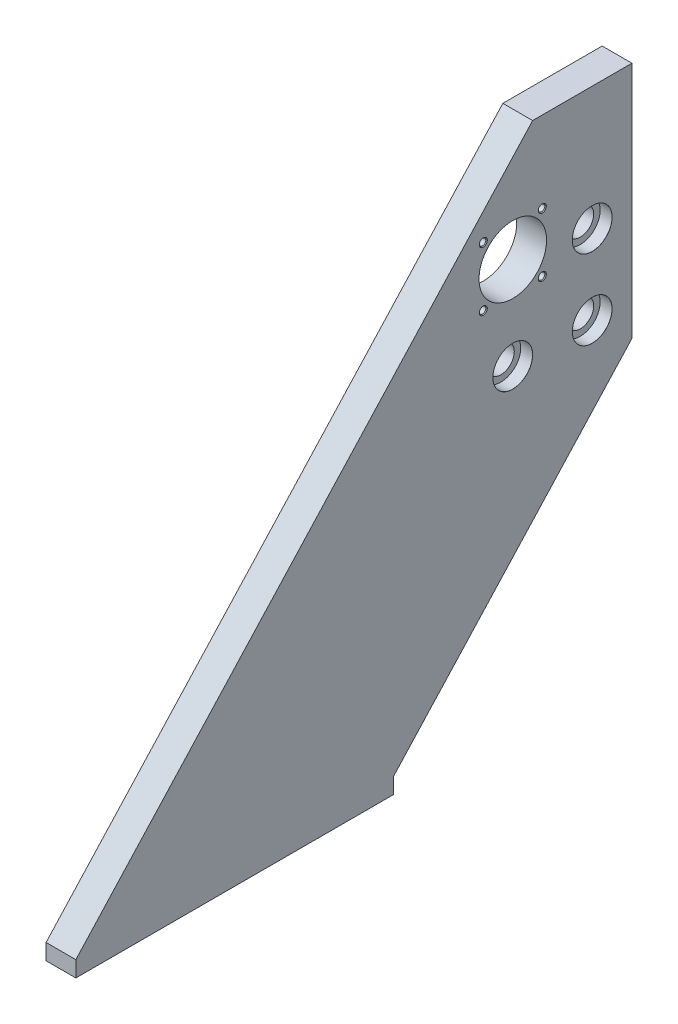
ISO-10303-21;
HEADER;
FILE_DESCRIPTION(('STEP AP214'),'2;1');
FILE_NAME('part.step','',(''),(''),'','','');
FILE_SCHEMA(('AUTOMOTIVE_DESIGN { 1 0 10303 214 1 1 1 1 }'));
ENDSEC;
DATA;
#1=APPLICATION_CONTEXT('core data for automotive mechanical design processes');
#2=APPLICATION_PROTOCOL_DEFINITION('international standard','automotive_design',2000,#1);
#3=PRODUCT_CONTEXT('',#1,'mechanical');
#4=PRODUCT('Part','Part','',(#3));
#5=PRODUCT_RELATED_PRODUCT_CATEGORY('part','',(#4));
#6=PRODUCT_DEFINITION_FORMATION('','',#4);
#7=PRODUCT_DEFINITION_CONTEXT('part definition',#1,'design');
#8=PRODUCT_DEFINITION('design','',#6,#7);
#9=PRODUCT_DEFINITION_SHAPE('','',#8);
#10=(LENGTH_UNIT() NAMED_UNIT(*) SI_UNIT(.MILLI.,.METRE.));
#11=(NAMED_UNIT(*) PLANE_ANGLE_UNIT() SI_UNIT($,.RADIAN.));
#12=(NAMED_UNIT(*) SI_UNIT($,.STERADIAN.) SOLID_ANGLE_UNIT());
#13=UNCERTAINTY_MEASURE_WITH_UNIT(LENGTH_MEASURE(1.E-05),#10,'distance_accuracy_value','');
#14=(GEOMETRIC_REPRESENTATION_CONTEXT(3) GLOBAL_UNCERTAINTY_ASSIGNED_CONTEXT((#13)) GLOBAL_UNIT_ASSIGNED_CONTEXT((#10,
#11,#12)) REPRESENTATION_CONTEXT('',''));
#15=CARTESIAN_POINT('',(0.,0.,0.));
#16=DIRECTION('',(0.,0.,1.));
#17=DIRECTION('',(1.,0.,0.));
#18=AXIS2_PLACEMENT_3D('',#15,#16,#17);
#19=CARTESIAN_POINT('',(7.5,8.,80.));
#20=DIRECTION('',(0.,0.,-1.));
#21=DIRECTION('',(0.,1.,0.));
#22=AXIS2_PLACEMENT_3D('',#19,#20,#21);
#23=PLANE('',#22);
#24=DIRECTION('',(0.,-1.,0.));
#25=VECTOR('',#24,1.);
#26=CARTESIAN_POINT('',(-7.5,8.,80.));
#27=LINE('',#26,#25);
#28=CARTESIAN_POINT('',(-7.5,8.,80.));
#29=VERTEX_POINT('',#28);
#30=CARTESIAN_POINT('',(-7.5,0.,80.));
#31=VERTEX_POINT('',#30);
#32=EDGE_CURVE('E132',#29,#31,#27,.T.);
#33=ORIENTED_EDGE('',*,*,#32,.T.);
#34=DIRECTION('',(-1.,0.,0.));
#35=VECTOR('',#34,1.);
#36=CARTESIAN_POINT('',(7.5,0.,80.));
#37=LINE('',#36,#35);
#38=CARTESIAN_POINT('',(7.5,0.,80.));
#39=VERTEX_POINT('',#38);
#40=EDGE_CURVE('E11',#39,#31,#37,.T.);
#41=ORIENTED_EDGE('',*,*,#40,.F.);
#42=DIRECTION('',(0.,-1.,0.));
#43=VECTOR('',#42,1.);
#44=CARTESIAN_POINT('',(7.5,8.,80.));
#45=LINE('',#44,#43);
#46=CARTESIAN_POINT('',(7.5,8.,80.));
#47=VERTEX_POINT('',#46);
#48=EDGE_CURVE('E145',#47,#39,#45,.T.);
#49=ORIENTED_EDGE('',*,*,#48,.F.);
#50=DIRECTION('',(-1.,0.,0.));
#51=VECTOR('',#50,1.);
#52=CARTESIAN_POINT('',(7.5,8.,80.));
#53=LINE('',#52,#51);
#54=EDGE_CURVE('E128',#47,#29,#53,.T.);
#55=ORIENTED_EDGE('',*,*,#54,.T.);
#56=EDGE_LOOP('',(#33,#41,#49,#55));
#57=FACE_BOUND('',#56,.T.);
#58=ADVANCED_FACE('F39',(#57),#23,.F.);
#59=CARTESIAN_POINT('',(7.5,0.,0.));
#60=DIRECTION('',(0.,1.,0.));
#61=DIRECTION('',(0.,0.,1.));
#62=AXIS2_PLACEMENT_3D('',#59,#60,#61);
#63=PLANE('',#62);
#64=CARTESIAN_POINT('',(0.,0.,50.));
#65=DIRECTION('',(0.,-1.,0.));
#66=DIRECTION('',(0.,0.,-1.));
#67=AXIS2_PLACEMENT_3D('',#64,#65,#66);
#68=CIRCLE('',#67,3.4);
#69=CARTESIAN_POINT('',(0.,0.,46.6));
#70=VERTEX_POINT('',#69);
#71=EDGE_CURVE('E176',#70,#70,#68,.T.);
#72=ORIENTED_EDGE('',*,*,#71,.F.);
#73=EDGE_LOOP('',(#72));
#74=FACE_BOUND('',#73,.T.);
#75=CARTESIAN_POINT('',(0.,0.,-50.));
#76=DIRECTION('',(0.,-1.,0.));
#77=DIRECTION('',(0.,0.,-1.));
#78=AXIS2_PLACEMENT_3D('',#75,#76,#77);
#79=CIRCLE('',#78,3.4);
#80=CARTESIAN_POINT('',(0.,0.,-53.4));
#81=VERTEX_POINT('',#80);
#82=EDGE_CURVE('E170',#81,#81,#79,.T.);
#83=ORIENTED_EDGE('',*,*,#82,.F.);
#84=EDGE_LOOP('',(#83));
#85=FACE_BOUND('',#84,.T.);
#86=DIRECTION('',(0.,0.,-1.));
#87=VECTOR('',#86,1.);
#88=CARTESIAN_POINT('',(-7.5,0.,0.));
#89=LINE('',#88,#87);
#90=CARTESIAN_POINT('',(-7.5,0.,-80.));
#91=VERTEX_POINT('',#90);
#92=EDGE_CURVE('E135',#31,#91,#89,.T.);
#93=ORIENTED_EDGE('',*,*,#92,.T.);
#94=DIRECTION('',(-1.,0.,0.));
#95=VECTOR('',#94,1.);
#96=CARTESIAN_POINT('',(7.5,0.,-80.));
#97=LINE('',#96,#95);
#98=CARTESIAN_POINT('',(7.5,0.,-80.));
#99=VERTEX_POINT('',#98);
#100=EDGE_CURVE('E47',#99,#91,#97,.T.);
#101=ORIENTED_EDGE('',*,*,#100,.F.);
#102=DIRECTION('',(0.,0.,-1.));
#103=VECTOR('',#102,1.);
#104=CARTESIAN_POINT('',(7.5,0.,80.));
#105=LINE('',#104,#103);
#106=EDGE_CURVE('E96',#39,#99,#105,.T.);
#107=ORIENTED_EDGE('',*,*,#106,.F.);
#108=ORIENTED_EDGE('',*,*,#40,.T.);
#109=EDGE_LOOP('',(#93,#101,#107,#108));
#110=FACE_BOUND('',#109,.T.);
#111=ADVANCED_FACE('F305',(#74,#85,#110),#63,.F.);
#112=CARTESIAN_POINT('',(7.5,0.,-80.));
#113=DIRECTION('',(0.,0.,1.));
#114=DIRECTION('',(1.,0.,0.));
#115=AXIS2_PLACEMENT_3D('',#112,#113,#114);
#116=PLANE('',#115);
#117=DIRECTION('',(0.,1.,0.));
#118=VECTOR('',#117,1.);
#119=CARTESIAN_POINT('',(-7.5,0.,-80.));
#120=LINE('',#119,#118);
#121=CARTESIAN_POINT('',(-7.5,8.,-80.));
#122=VERTEX_POINT('',#121);
#123=EDGE_CURVE('E138',#91,#122,#120,.T.);
#124=ORIENTED_EDGE('',*,*,#123,.T.);
#125=DIRECTION('',(-1.,0.,0.));
#126=VECTOR('',#125,1.);
#127=CARTESIAN_POINT('',(7.5,8.,-80.));
#128=LINE('',#127,#126);
#129=CARTESIAN_POINT('',(7.5,8.,-80.));
#130=VERTEX_POINT('',#129);
#131=EDGE_CURVE('E149',#130,#122,#128,.T.);
#132=ORIENTED_EDGE('',*,*,#131,.F.);
#133=DIRECTION('',(0.,1.,0.));
#134=VECTOR('',#133,1.);
#135=CARTESIAN_POINT('',(7.5,0.,-80.));
#136=LINE('',#135,#134);
#137=EDGE_CURVE('E157',#99,#130,#136,.T.);
#138=ORIENTED_EDGE('',*,*,#137,.F.);
#139=ORIENTED_EDGE('',*,*,#100,.T.);
#140=EDGE_LOOP('',(#124,#132,#138,#139));
#141=FACE_BOUND('',#140,.T.);
#142=ADVANCED_FACE('F155',(#141),#116,.F.);
#143=CARTESIAN_POINT('',(7.5,8.,-80.));
#144=DIRECTION('',(0.,0.675724628517346,0.737154140200741));
#145=DIRECTION('',(0.,-0.737154140200741,0.675724628517346));
#146=AXIS2_PLACEMENT_3D('',#143,#144,#145);
#147=PLANE('',#146);
#148=DIRECTION('',(0.,0.737154140200741,-0.675724628517346));
#149=VECTOR('',#148,1.);
#150=CARTESIAN_POINT('',(-7.5,8.,-80.));
#151=LINE('',#150,#149);
#152=CARTESIAN_POINT('',(-7.5,138.909090909091,-200.));
#153=VERTEX_POINT('',#152);
#154=EDGE_CURVE('E140',#122,#153,#151,.T.);
#155=ORIENTED_EDGE('',*,*,#154,.T.);
#156=DIRECTION('',(-1.,0.,0.));
#157=VECTOR('',#156,1.);
#158=CARTESIAN_POINT('',(7.5,138.909090909091,-200.));
#159=LINE('',#158,#157);
#160=CARTESIAN_POINT('',(7.5,138.909090909091,-200.));
#161=VERTEX_POINT('',#160);
#162=EDGE_CURVE('E123',#161,#153,#159,.T.);
#163=ORIENTED_EDGE('',*,*,#162,.F.);
#164=DIRECTION('',(0.,0.737154140200741,-0.675724628517346));
#165=VECTOR('',#164,1.);
#166=CARTESIAN_POINT('',(7.5,8.,-80.));
#167=LINE('',#166,#165);
#168=EDGE_CURVE('E114',#130,#161,#167,.T.);
#169=ORIENTED_EDGE('',*,*,#168,.F.);
#170=ORIENTED_EDGE('',*,*,#131,.T.);
#171=EDGE_LOOP('',(#155,#163,#169,#170));
#172=FACE_BOUND('',#171,.T.);
#173=ADVANCED_FACE('F163',(#172),#147,.F.);
#174=CARTESIAN_POINT('',(7.5,138.909090909091,-200.));
#175=DIRECTION('',(0.,0.,1.));
#176=DIRECTION('',(1.,0.,0.));
#177=AXIS2_PLACEMENT_3D('',#174,#175,#176);
#178=PLANE('',#177);
#179=DIRECTION('',(0.,1.,0.));
#180=VECTOR('',#179,1.);
#181=CARTESIAN_POINT('',(-7.5,138.909090909091,-200.));
#182=LINE('',#181,#180);
#183=CARTESIAN_POINT('',(-7.5,258.909090909091,-200.));
#184=VERTEX_POINT('',#183);
#185=EDGE_CURVE('E122',#153,#184,#182,.T.);
#186=ORIENTED_EDGE('',*,*,#185,.T.);
#187=DIRECTION('',(-1.,0.,0.));
#188=VECTOR('',#187,1.);
#189=CARTESIAN_POINT('',(7.5,258.909090909091,-200.));
#190=LINE('',#189,#188);
#191=CARTESIAN_POINT('',(7.5,258.909090909091,-200.));
#192=VERTEX_POINT('',#191);
#193=EDGE_CURVE('E119',#192,#184,#190,.T.);
#194=ORIENTED_EDGE('',*,*,#193,.F.);
#195=DIRECTION('',(0.,1.,0.));
#196=VECTOR('',#195,1.);
#197=CARTESIAN_POINT('',(7.5,138.909090909091,-200.));
#198=LINE('',#197,#196);
#199=EDGE_CURVE('E108',#161,#192,#198,.T.);
#200=ORIENTED_EDGE('',*,*,#199,.F.);
#201=ORIENTED_EDGE('',*,*,#162,.T.);
#202=EDGE_LOOP('',(#186,#194,#200,#201));
#203=FACE_BOUND('',#202,.T.);
#204=ADVANCED_FACE('F120',(#203),#178,.F.);
#205=CARTESIAN_POINT('',(7.5,258.909090909091,-200.));
#206=DIRECTION('',(0.,-1.,0.));
#207=DIRECTION('',(0.,0.,-1.));
#208=AXIS2_PLACEMENT_3D('',#205,#206,#207);
#209=PLANE('',#208);
#210=DIRECTION('',(0.,0.,1.));
#211=VECTOR('',#210,1.);
#212=CARTESIAN_POINT('',(-7.5,258.909090909091,-200.));
#213=LINE('',#212,#211);
#214=CARTESIAN_POINT('',(-7.5,258.909090909091,-150.));
#215=VERTEX_POINT('',#214);
#216=EDGE_CURVE('E82',#184,#215,#213,.T.);
#217=ORIENTED_EDGE('',*,*,#216,.T.);
#218=DIRECTION('',(-1.,0.,0.));
#219=VECTOR('',#218,1.);
#220=CARTESIAN_POINT('',(7.5,258.909090909091,-150.));
#221=LINE('',#220,#219);
#222=CARTESIAN_POINT('',(7.5,258.909090909091,-150.));
#223=VERTEX_POINT('',#222);
#224=EDGE_CURVE('E124',#223,#215,#221,.T.);
#225=ORIENTED_EDGE('',*,*,#224,.F.);
#226=DIRECTION('',(0.,0.,1.));
#227=VECTOR('',#226,1.);
#228=CARTESIAN_POINT('',(7.5,258.909090909091,-200.));
#229=LINE('',#228,#227);
#230=EDGE_CURVE('E112',#192,#223,#229,.T.);
#231=ORIENTED_EDGE('',*,*,#230,.F.);
#232=ORIENTED_EDGE('',*,*,#193,.T.);
#233=EDGE_LOOP('',(#217,#225,#231,#232));
#234=FACE_BOUND('',#233,.T.);
#235=ADVANCED_FACE('F126',(#234),#209,.F.);
#236=CARTESIAN_POINT('',(7.5,258.909090909091,-150.));
#237=DIRECTION('',(0.,-0.675724628517346,-0.737154140200741));
#238=DIRECTION('',(0.,0.737154140200741,-0.675724628517346));
#239=AXIS2_PLACEMENT_3D('',#236,#237,#238);
#240=PLANE('',#239);
#241=DIRECTION('',(0.,-0.737154140200741,0.675724628517346));
#242=VECTOR('',#241,1.);
#243=CARTESIAN_POINT('',(-7.5,258.909090909091,-150.));
#244=LINE('',#243,#242);
#245=EDGE_CURVE('E88',#215,#29,#244,.T.);
#246=ORIENTED_EDGE('',*,*,#245,.T.);
#247=ORIENTED_EDGE('',*,*,#54,.F.);
#248=DIRECTION('',(0.,-0.737154140200741,0.675724628517346));
#249=VECTOR('',#248,1.);
#250=CARTESIAN_POINT('',(7.5,258.909090909091,-150.));
#251=LINE('',#250,#249);
#252=EDGE_CURVE('E55',#223,#47,#251,.T.);
#253=ORIENTED_EDGE('',*,*,#252,.F.);
#254=ORIENTED_EDGE('',*,*,#224,.T.);
#255=EDGE_LOOP('',(#246,#247,#253,#254));
#256=FACE_BOUND('',#255,.T.);
#257=ADVANCED_FACE('F271',(#256),#240,.F.);
#258=CARTESIAN_POINT('',(7.5,0.,0.));
#259=DIRECTION('',(1.,0.,0.));
#260=DIRECTION('',(0.,0.,-1.));
#261=AXIS2_PLACEMENT_3D('',#258,#259,#260);
#262=PLANE('',#261);
#263=CARTESIAN_POINT('',(7.5,218.149242404918,-154.849242404918));
#264=DIRECTION('',(1.,0.,0.));
#265=DIRECTION('',(0.,0.,-1.));
#266=AXIS2_PLACEMENT_3D('',#263,#264,#265);
#267=CIRCLE('',#266,2.025);
#268=CARTESIAN_POINT('',(7.5,218.149242404918,-156.874242404918));
#269=VERTEX_POINT('',#268);
#270=EDGE_CURVE('E263',#269,#269,#267,.T.);
#271=ORIENTED_EDGE('',*,*,#270,.F.);
#272=EDGE_LOOP('',(#271));
#273=FACE_BOUND('',#272,.T.);
#274=CARTESIAN_POINT('',(7.5,188.450757595082,-154.849242404918));
#275=DIRECTION('',(1.,0.,0.));
#276=DIRECTION('',(0.,0.,-1.));
#277=AXIS2_PLACEMENT_3D('',#274,#275,#276);
#278=CIRCLE('',#277,2.025);
#279=CARTESIAN_POINT('',(7.5,188.450757595082,-156.874242404918));
#280=VERTEX_POINT('',#279);
#281=EDGE_CURVE('E254',#280,#280,#278,.T.);
#282=ORIENTED_EDGE('',*,*,#281,.F.);
#283=EDGE_LOOP('',(#282));
#284=FACE_BOUND('',#283,.T.);
#285=CARTESIAN_POINT('',(7.5,188.450757595083,-125.150757595083));
#286=DIRECTION('',(1.,0.,0.));
#287=DIRECTION('',(0.,0.,-1.));
#288=AXIS2_PLACEMENT_3D('',#285,#286,#287);
#289=CIRCLE('',#288,2.025);
#290=CARTESIAN_POINT('',(7.5,188.450757595083,-127.175757595083));
#291=VERTEX_POINT('',#290);
#292=EDGE_CURVE('E245',#291,#291,#289,.T.);
#293=ORIENTED_EDGE('',*,*,#292,.F.);
#294=EDGE_LOOP('',(#293));
#295=FACE_BOUND('',#294,.T.);
#296=CARTESIAN_POINT('',(7.5,218.149242404917,-125.150757595082));
#297=DIRECTION('',(1.,0.,0.));
#298=DIRECTION('',(0.,0.,-1.));
#299=AXIS2_PLACEMENT_3D('',#296,#297,#298);
#300=CIRCLE('',#299,2.025);
#301=CARTESIAN_POINT('',(7.5,218.149242404917,-127.175757595082));
#302=VERTEX_POINT('',#301);
#303=EDGE_CURVE('E236',#302,#302,#300,.T.);
#304=ORIENTED_EDGE('',*,*,#303,.F.);
#305=EDGE_LOOP('',(#304));
#306=FACE_BOUND('',#305,.T.);
#307=CARTESIAN_POINT('',(7.5,203.3,-140.));
#308=DIRECTION('',(1.,0.,0.));
#309=DIRECTION('',(0.,0.,-1.));
#310=AXIS2_PLACEMENT_3D('',#307,#308,#309);
#311=CIRCLE('',#310,17.);
#312=CARTESIAN_POINT('',(7.5,203.3,-157.));
#313=VERTEX_POINT('',#312);
#314=EDGE_CURVE('E225',#313,#313,#311,.T.);
#315=ORIENTED_EDGE('',*,*,#314,.F.);
#316=EDGE_LOOP('',(#315));
#317=FACE_BOUND('',#316,.T.);
#318=CARTESIAN_POINT('',(7.5,196.809090909091,-180.));
#319=DIRECTION('',(1.,0.,0.));
#320=DIRECTION('',(0.,0.,-1.));
#321=AXIS2_PLACEMENT_3D('',#318,#319,#320);
#322=CIRCLE('',#321,10.025);
#323=CARTESIAN_POINT('',(7.5,196.809090909091,-190.025));
#324=VERTEX_POINT('',#323);
#325=EDGE_CURVE('E221',#324,#324,#322,.T.);
#326=ORIENTED_EDGE('',*,*,#325,.F.);
#327=EDGE_LOOP('',(#326));
#328=FACE_BOUND('',#327,.T.);
#329=CARTESIAN_POINT('',(7.5,156.809090909091,-180.));
#330=DIRECTION('',(1.,0.,0.));
#331=DIRECTION('',(0.,0.,-1.));
#332=AXIS2_PLACEMENT_3D('',#329,#330,#331);
#333=CIRCLE('',#332,10.025);
#334=CARTESIAN_POINT('',(7.5,156.809090909091,-190.025));
#335=VERTEX_POINT('',#334);
#336=EDGE_CURVE('E206',#335,#335,#333,.T.);
#337=ORIENTED_EDGE('',*,*,#336,.F.);
#338=EDGE_LOOP('',(#337));
#339=FACE_BOUND('',#338,.T.);
#340=CARTESIAN_POINT('',(7.5,156.809090909091,-140.));
#341=DIRECTION('',(1.,0.,0.));
#342=DIRECTION('',(0.,0.,-1.));
#343=AXIS2_PLACEMENT_3D('',#340,#341,#342);
#344=CIRCLE('',#343,10.025);
#345=CARTESIAN_POINT('',(7.5,156.809090909091,-150.025));
#346=VERTEX_POINT('',#345);
#347=EDGE_CURVE('E191',#346,#346,#344,.T.);
#348=ORIENTED_EDGE('',*,*,#347,.F.);
#349=EDGE_LOOP('',(#348));
#350=FACE_BOUND('',#349,.T.);
#351=ORIENTED_EDGE('',*,*,#48,.T.);
#352=ORIENTED_EDGE('',*,*,#106,.T.);
#353=ORIENTED_EDGE('',*,*,#137,.T.);
#354=ORIENTED_EDGE('',*,*,#168,.T.);
#355=ORIENTED_EDGE('',*,*,#199,.T.);
#356=ORIENTED_EDGE('',*,*,#230,.T.);
#357=ORIENTED_EDGE('',*,*,#252,.T.);
#358=EDGE_LOOP('',(#351,#352,#353,#354,#355,#356,#357));
#359=FACE_BOUND('',#358,.T.);
#360=ADVANCED_FACE('F110',(#273,#284,#295,#306,#317,#328,#339,#350,#359),#262,.T.);
#361=CARTESIAN_POINT('',(-7.5,0.,0.));
#362=DIRECTION('',(1.,0.,0.));
#363=DIRECTION('',(0.,0.,-1.));
#364=AXIS2_PLACEMENT_3D('',#361,#362,#363);
#365=PLANE('',#364);
#366=CARTESIAN_POINT('',(-7.5,218.149242404918,-154.849242404918));
#367=DIRECTION('',(1.,0.,0.));
#368=DIRECTION('',(0.,0.,-1.));
#369=AXIS2_PLACEMENT_3D('',#366,#367,#368);
#370=CIRCLE('',#369,1.64999999999998);
#371=CARTESIAN_POINT('',(-7.5,218.149242404918,-156.499242404918));
#372=VERTEX_POINT('',#371);
#373=EDGE_CURVE('E257',#372,#372,#370,.T.);
#374=ORIENTED_EDGE('',*,*,#373,.T.);
#375=EDGE_LOOP('',(#374));
#376=FACE_BOUND('',#375,.T.);
#377=CARTESIAN_POINT('',(-7.5,188.450757595082,-154.849242404918));
#378=DIRECTION('',(1.,0.,0.));
#379=DIRECTION('',(0.,0.,-1.));
#380=AXIS2_PLACEMENT_3D('',#377,#378,#379);
#381=CIRCLE('',#380,1.64999999999998);
#382=CARTESIAN_POINT('',(-7.5,188.450757595082,-156.499242404918));
#383=VERTEX_POINT('',#382);
#384=EDGE_CURVE('E248',#383,#383,#381,.T.);
#385=ORIENTED_EDGE('',*,*,#384,.T.);
#386=EDGE_LOOP('',(#385));
#387=FACE_BOUND('',#386,.T.);
#388=CARTESIAN_POINT('',(-7.5,188.450757595083,-125.150757595083));
#389=DIRECTION('',(1.,0.,0.));
#390=DIRECTION('',(0.,0.,-1.));
#391=AXIS2_PLACEMENT_3D('',#388,#389,#390);
#392=CIRCLE('',#391,1.64999999999998);
#393=CARTESIAN_POINT('',(-7.5,188.450757595083,-126.800757595083));
#394=VERTEX_POINT('',#393);
#395=EDGE_CURVE('E239',#394,#394,#392,.T.);
#396=ORIENTED_EDGE('',*,*,#395,.T.);
#397=EDGE_LOOP('',(#396));
#398=FACE_BOUND('',#397,.T.);
#399=CARTESIAN_POINT('',(-7.5,218.149242404917,-125.150757595082));
#400=DIRECTION('',(1.,0.,0.));
#401=DIRECTION('',(0.,0.,-1.));
#402=AXIS2_PLACEMENT_3D('',#399,#400,#401);
#403=CIRCLE('',#402,1.64999999999998);
#404=CARTESIAN_POINT('',(-7.5,218.149242404917,-126.800757595082));
#405=VERTEX_POINT('',#404);
#406=EDGE_CURVE('E228',#405,#405,#403,.T.);
#407=ORIENTED_EDGE('',*,*,#406,.T.);
#408=EDGE_LOOP('',(#407));
#409=FACE_BOUND('',#408,.T.);
#410=CARTESIAN_POINT('',(-7.5,203.3,-140.));
#411=DIRECTION('',(1.,0.,0.));
#412=DIRECTION('',(0.,0.,-1.));
#413=AXIS2_PLACEMENT_3D('',#410,#411,#412);
#414=CIRCLE('',#413,17.);
#415=CARTESIAN_POINT('',(-7.5,203.3,-157.));
#416=VERTEX_POINT('',#415);
#417=EDGE_CURVE('E224',#416,#416,#414,.T.);
#418=ORIENTED_EDGE('',*,*,#417,.T.);
#419=EDGE_LOOP('',(#418));
#420=FACE_BOUND('',#419,.T.);
#421=CARTESIAN_POINT('',(-7.5,196.809090909091,-180.));
#422=DIRECTION('',(1.,0.,0.));
#423=DIRECTION('',(0.,0.,-1.));
#424=AXIS2_PLACEMENT_3D('',#421,#422,#423);
#425=CIRCLE('',#424,6.75000000000001);
#426=CARTESIAN_POINT('',(-7.5,196.809090909091,-186.75));
#427=VERTEX_POINT('',#426);
#428=EDGE_CURVE('E209',#427,#427,#425,.T.);
#429=ORIENTED_EDGE('',*,*,#428,.T.);
#430=EDGE_LOOP('',(#429));
#431=FACE_BOUND('',#430,.T.);
#432=CARTESIAN_POINT('',(-7.5,156.809090909091,-180.));
#433=DIRECTION('',(1.,0.,0.));
#434=DIRECTION('',(0.,0.,-1.));
#435=AXIS2_PLACEMENT_3D('',#432,#433,#434);
#436=CIRCLE('',#435,6.75000000000001);
#437=CARTESIAN_POINT('',(-7.5,156.809090909091,-186.75));
#438=VERTEX_POINT('',#437);
#439=EDGE_CURVE('E194',#438,#438,#436,.T.);
#440=ORIENTED_EDGE('',*,*,#439,.T.);
#441=EDGE_LOOP('',(#440));
#442=FACE_BOUND('',#441,.T.);
#443=CARTESIAN_POINT('',(-7.5,156.809090909091,-140.));
#444=DIRECTION('',(1.,0.,0.));
#445=DIRECTION('',(0.,0.,-1.));
#446=AXIS2_PLACEMENT_3D('',#443,#444,#445);
#447=CIRCLE('',#446,6.75000000000001);
#448=CARTESIAN_POINT('',(-7.5,156.809090909091,-146.75));
#449=VERTEX_POINT('',#448);
#450=EDGE_CURVE('E179',#449,#449,#447,.T.);
#451=ORIENTED_EDGE('',*,*,#450,.T.);
#452=EDGE_LOOP('',(#451));
#453=FACE_BOUND('',#452,.T.);
#454=ORIENTED_EDGE('',*,*,#32,.F.);
#455=ORIENTED_EDGE('',*,*,#245,.F.);
#456=ORIENTED_EDGE('',*,*,#216,.F.);
#457=ORIENTED_EDGE('',*,*,#185,.F.);
#458=ORIENTED_EDGE('',*,*,#154,.F.);
#459=ORIENTED_EDGE('',*,*,#123,.F.);
#460=ORIENTED_EDGE('',*,*,#92,.F.);
#461=EDGE_LOOP('',(#454,#455,#456,#457,#458,#459,#460));
#462=FACE_BOUND('',#461,.T.);
#463=ADVANCED_FACE('F161',(#376,#387,#398,#409,#420,#431,#442,#453,#462),#365,.F.);
#464=CARTESIAN_POINT('',(0.,30.,-50.));
#465=DIRECTION('',(0.,-1.,0.));
#466=DIRECTION('',(0.,0.,-1.));
#467=AXIS2_PLACEMENT_3D('',#464,#465,#466);
#468=CONICAL_SURFACE('',#467,3.39999999999999,1.02974425867665);
#469=CARTESIAN_POINT('',(0.,32.0429261046937,-50.));
#470=VERTEX_POINT('',#469);
#471=VERTEX_LOOP('',#470);
#472=FACE_BOUND('',#471,.T.);
#473=CARTESIAN_POINT('',(0.,30.,-50.));
#474=DIRECTION('',(0.,-1.,0.));
#475=DIRECTION('',(0.,0.,-1.));
#476=AXIS2_PLACEMENT_3D('',#473,#474,#475);
#477=CIRCLE('',#476,3.39999999999999);
#478=CARTESIAN_POINT('',(0.,30.,-53.4));
#479=VERTEX_POINT('',#478);
#480=EDGE_CURVE('E136',#479,#479,#477,.T.);
#481=ORIENTED_EDGE('',*,*,#480,.T.);
#482=EDGE_LOOP('',(#481));
#483=FACE_BOUND('',#482,.T.);
#484=ADVANCED_FACE('F357',(#472,#483),#468,.F.);
#485=CARTESIAN_POINT('',(0.,0.,-50.));
#486=DIRECTION('',(0.,-1.,0.));
#487=DIRECTION('',(0.,0.,-1.));
#488=AXIS2_PLACEMENT_3D('',#485,#486,#487);
#489=CYLINDRICAL_SURFACE('',#488,3.4);
#490=ORIENTED_EDGE('',*,*,#480,.F.);
#491=EDGE_LOOP('',(#490));
#492=FACE_BOUND('',#491,.T.);
#493=ORIENTED_EDGE('',*,*,#82,.T.);
#494=EDGE_LOOP('',(#493));
#495=FACE_BOUND('',#494,.T.);
#496=ADVANCED_FACE('F362',(#492,#495),#489,.F.);
#497=CARTESIAN_POINT('',(0.,30.,50.));
#498=DIRECTION('',(0.,-1.,0.));
#499=DIRECTION('',(0.,0.,-1.));
#500=AXIS2_PLACEMENT_3D('',#497,#498,#499);
#501=CONICAL_SURFACE('',#500,3.39999999999999,1.02974425867665);
#502=CARTESIAN_POINT('',(0.,32.0429261046937,50.));
#503=VERTEX_POINT('',#502);
#504=VERTEX_LOOP('',#503);
#505=FACE_BOUND('',#504,.T.);
#506=CARTESIAN_POINT('',(0.,30.,50.));
#507=DIRECTION('',(0.,-1.,0.));
#508=DIRECTION('',(0.,0.,-1.));
#509=AXIS2_PLACEMENT_3D('',#506,#507,#508);
#510=CIRCLE('',#509,3.39999999999999);
#511=CARTESIAN_POINT('',(0.,30.,46.6));
#512=VERTEX_POINT('',#511);
#513=EDGE_CURVE('E173',#512,#512,#510,.T.);
#514=ORIENTED_EDGE('',*,*,#513,.T.);
#515=EDGE_LOOP('',(#514));
#516=FACE_BOUND('',#515,.T.);
#517=ADVANCED_FACE('F375',(#505,#516),#501,.F.);
#518=CARTESIAN_POINT('',(0.,0.,50.));
#519=DIRECTION('',(0.,-1.,0.));
#520=DIRECTION('',(0.,0.,-1.));
#521=AXIS2_PLACEMENT_3D('',#518,#519,#520);
#522=CYLINDRICAL_SURFACE('',#521,3.4);
#523=ORIENTED_EDGE('',*,*,#513,.F.);
#524=EDGE_LOOP('',(#523));
#525=FACE_BOUND('',#524,.T.);
#526=ORIENTED_EDGE('',*,*,#71,.T.);
#527=EDGE_LOOP('',(#526));
#528=FACE_BOUND('',#527,.T.);
#529=ADVANCED_FACE('F388',(#525,#528),#522,.F.);
#530=CARTESIAN_POINT('',(7.5,156.809090909091,-140.));
#531=DIRECTION('',(1.,0.,0.));
#532=DIRECTION('',(0.,0.,-1.));
#533=AXIS2_PLACEMENT_3D('',#530,#531,#532);
#534=CYLINDRICAL_SURFACE('',#533,6.75000000000001);
#535=ORIENTED_EDGE('',*,*,#450,.F.);
#536=EDGE_LOOP('',(#535));
#537=FACE_BOUND('',#536,.T.);
#538=CARTESIAN_POINT('',(1.5,156.809090909091,-140.));
#539=DIRECTION('',(1.,0.,0.));
#540=DIRECTION('',(0.,0.,-1.));
#541=AXIS2_PLACEMENT_3D('',#538,#539,#540);
#542=CIRCLE('',#541,6.75000000000001);
#543=CARTESIAN_POINT('',(1.5,156.809090909091,-146.75));
#544=VERTEX_POINT('',#543);
#545=EDGE_CURVE('E182',#544,#544,#542,.T.);
#546=ORIENTED_EDGE('',*,*,#545,.T.);
#547=EDGE_LOOP('',(#546));
#548=FACE_BOUND('',#547,.T.);
#549=ADVANCED_FACE('F398',(#537,#548),#534,.F.);
#550=CARTESIAN_POINT('',(1.5,166.809090909091,-140.));
#551=DIRECTION('',(-1.,0.,0.));
#552=DIRECTION('',(0.,0.,1.));
#553=AXIS2_PLACEMENT_3D('',#550,#551,#552);
#554=PLANE('',#553);
#555=ORIENTED_EDGE('',*,*,#545,.F.);
#556=EDGE_LOOP('',(#555));
#557=FACE_BOUND('',#556,.T.);
#558=CARTESIAN_POINT('',(1.5,156.809090909091,-140.));
#559=DIRECTION('',(1.,0.,0.));
#560=DIRECTION('',(0.,0.,-1.));
#561=AXIS2_PLACEMENT_3D('',#558,#559,#560);
#562=CIRCLE('',#561,10.);
#563=CARTESIAN_POINT('',(1.5,156.809090909091,-150.));
#564=VERTEX_POINT('',#563);
#565=EDGE_CURVE('E185',#564,#564,#562,.T.);
#566=ORIENTED_EDGE('',*,*,#565,.T.);
#567=EDGE_LOOP('',(#566));
#568=FACE_BOUND('',#567,.T.);
#569=ADVANCED_FACE('F300',(#557,#568),#554,.F.);
#570=CARTESIAN_POINT('',(7.5,156.809090909091,-140.));
#571=DIRECTION('',(1.,0.,0.));
#572=DIRECTION('',(0.,0.,-1.));
#573=AXIS2_PLACEMENT_3D('',#570,#571,#572);
#574=CYLINDRICAL_SURFACE('',#573,10.);
#575=ORIENTED_EDGE('',*,*,#565,.F.);
#576=EDGE_LOOP('',(#575));
#577=FACE_BOUND('',#576,.T.);
#578=CARTESIAN_POINT('',(7.475,156.809090909091,-140.));
#579=DIRECTION('',(1.,0.,0.));
#580=DIRECTION('',(0.,0.,-1.));
#581=AXIS2_PLACEMENT_3D('',#578,#579,#580);
#582=CIRCLE('',#581,10.);
#583=CARTESIAN_POINT('',(7.475,156.809090909091,-150.));
#584=VERTEX_POINT('',#583);
#585=EDGE_CURVE('E188',#584,#584,#582,.T.);
#586=ORIENTED_EDGE('',*,*,#585,.T.);
#587=EDGE_LOOP('',(#586));
#588=FACE_BOUND('',#587,.T.);
#589=ADVANCED_FACE('F290',(#577,#588),#574,.F.);
#590=CARTESIAN_POINT('',(7.5,156.809090909091,-140.));
#591=DIRECTION('',(1.,0.,0.));
#592=DIRECTION('',(0.,0.,-1.));
#593=AXIS2_PLACEMENT_3D('',#590,#591,#592);
#594=CONICAL_SURFACE('',#593,10.025,0.785398163397309);
#595=ORIENTED_EDGE('',*,*,#585,.F.);
#596=EDGE_LOOP('',(#595));
#597=FACE_BOUND('',#596,.T.);
#598=ORIENTED_EDGE('',*,*,#347,.T.);
#599=EDGE_LOOP('',(#598));
#600=FACE_BOUND('',#599,.T.);
#601=ADVANCED_FACE('F287',(#597,#600),#594,.F.);
#602=CARTESIAN_POINT('',(7.5,156.809090909091,-180.));
#603=DIRECTION('',(1.,0.,0.));
#604=DIRECTION('',(0.,0.,-1.));
#605=AXIS2_PLACEMENT_3D('',#602,#603,#604);
#606=CYLINDRICAL_SURFACE('',#605,6.75000000000001);
#607=ORIENTED_EDGE('',*,*,#439,.F.);
#608=EDGE_LOOP('',(#607));
#609=FACE_BOUND('',#608,.T.);
#610=CARTESIAN_POINT('',(1.5,156.809090909091,-180.));
#611=DIRECTION('',(1.,0.,0.));
#612=DIRECTION('',(0.,0.,-1.));
#613=AXIS2_PLACEMENT_3D('',#610,#611,#612);
#614=CIRCLE('',#613,6.75000000000001);
#615=CARTESIAN_POINT('',(1.5,156.809090909091,-186.75));
#616=VERTEX_POINT('',#615);
#617=EDGE_CURVE('E197',#616,#616,#614,.T.);
#618=ORIENTED_EDGE('',*,*,#617,.T.);
#619=EDGE_LOOP('',(#618));
#620=FACE_BOUND('',#619,.T.);
#621=ADVANCED_FACE('F289',(#609,#620),#606,.F.);
#622=CARTESIAN_POINT('',(1.5,166.809090909091,-180.));
#623=DIRECTION('',(-1.,0.,0.));
#624=DIRECTION('',(0.,0.,1.));
#625=AXIS2_PLACEMENT_3D('',#622,#623,#624);
#626=PLANE('',#625);
#627=ORIENTED_EDGE('',*,*,#617,.F.);
#628=EDGE_LOOP('',(#627));
#629=FACE_BOUND('',#628,.T.);
#630=CARTESIAN_POINT('',(1.5,156.809090909091,-180.));
#631=DIRECTION('',(1.,0.,0.));
#632=DIRECTION('',(0.,0.,-1.));
#633=AXIS2_PLACEMENT_3D('',#630,#631,#632);
#634=CIRCLE('',#633,10.);
#635=CARTESIAN_POINT('',(1.5,156.809090909091,-190.));
#636=VERTEX_POINT('',#635);
#637=EDGE_CURVE('E200',#636,#636,#634,.T.);
#638=ORIENTED_EDGE('',*,*,#637,.T.);
#639=EDGE_LOOP('',(#638));
#640=FACE_BOUND('',#639,.T.);
#641=ADVANCED_FACE('F297',(#629,#640),#626,.F.);
#642=CARTESIAN_POINT('',(7.5,156.809090909091,-180.));
#643=DIRECTION('',(1.,0.,0.));
#644=DIRECTION('',(0.,0.,-1.));
#645=AXIS2_PLACEMENT_3D('',#642,#643,#644);
#646=CYLINDRICAL_SURFACE('',#645,10.);
#647=ORIENTED_EDGE('',*,*,#637,.F.);
#648=EDGE_LOOP('',(#647));
#649=FACE_BOUND('',#648,.T.);
#650=CARTESIAN_POINT('',(7.475,156.809090909091,-180.));
#651=DIRECTION('',(1.,0.,0.));
#652=DIRECTION('',(0.,0.,-1.));
#653=AXIS2_PLACEMENT_3D('',#650,#651,#652);
#654=CIRCLE('',#653,10.);
#655=CARTESIAN_POINT('',(7.475,156.809090909091,-190.));
#656=VERTEX_POINT('',#655);
#657=EDGE_CURVE('E203',#656,#656,#654,.T.);
#658=ORIENTED_EDGE('',*,*,#657,.T.);
#659=EDGE_LOOP('',(#658));
#660=FACE_BOUND('',#659,.T.);
#661=ADVANCED_FACE('F443',(#649,#660),#646,.F.);
#662=CARTESIAN_POINT('',(7.5,156.809090909091,-180.));
#663=DIRECTION('',(1.,0.,0.));
#664=DIRECTION('',(0.,0.,-1.));
#665=AXIS2_PLACEMENT_3D('',#662,#663,#664);
#666=CONICAL_SURFACE('',#665,10.025,0.785398163397309);
#667=ORIENTED_EDGE('',*,*,#657,.F.);
#668=EDGE_LOOP('',(#667));
#669=FACE_BOUND('',#668,.T.);
#670=ORIENTED_EDGE('',*,*,#336,.T.);
#671=EDGE_LOOP('',(#670));
#672=FACE_BOUND('',#671,.T.);
#673=ADVANCED_FACE('F453',(#669,#672),#666,.F.);
#674=CARTESIAN_POINT('',(7.5,196.809090909091,-180.));
#675=DIRECTION('',(1.,0.,0.));
#676=DIRECTION('',(0.,0.,-1.));
#677=AXIS2_PLACEMENT_3D('',#674,#675,#676);
#678=CYLINDRICAL_SURFACE('',#677,6.75000000000001);
#679=ORIENTED_EDGE('',*,*,#428,.F.);
#680=EDGE_LOOP('',(#679));
#681=FACE_BOUND('',#680,.T.);
#682=CARTESIAN_POINT('',(1.5,196.809090909091,-180.));
#683=DIRECTION('',(1.,0.,0.));
#684=DIRECTION('',(0.,0.,-1.));
#685=AXIS2_PLACEMENT_3D('',#682,#683,#684);
#686=CIRCLE('',#685,6.75000000000001);
#687=CARTESIAN_POINT('',(1.5,196.809090909091,-186.75));
#688=VERTEX_POINT('',#687);
#689=EDGE_CURVE('E212',#688,#688,#686,.T.);
#690=ORIENTED_EDGE('',*,*,#689,.T.);
#691=EDGE_LOOP('',(#690));
#692=FACE_BOUND('',#691,.T.);
#693=ADVANCED_FACE('F463',(#681,#692),#678,.F.);
#694=CARTESIAN_POINT('',(1.5,206.809090909091,-180.));
#695=DIRECTION('',(-1.,0.,0.));
#696=DIRECTION('',(0.,0.,1.));
#697=AXIS2_PLACEMENT_3D('',#694,#695,#696);
#698=PLANE('',#697);
#699=ORIENTED_EDGE('',*,*,#689,.F.);
#700=EDGE_LOOP('',(#699));
#701=FACE_BOUND('',#700,.T.);
#702=CARTESIAN_POINT('',(1.5,196.809090909091,-180.));
#703=DIRECTION('',(1.,0.,0.));
#704=DIRECTION('',(0.,0.,-1.));
#705=AXIS2_PLACEMENT_3D('',#702,#703,#704);
#706=CIRCLE('',#705,10.);
#707=CARTESIAN_POINT('',(1.5,196.809090909091,-190.));
#708=VERTEX_POINT('',#707);
#709=EDGE_CURVE('E215',#708,#708,#706,.T.);
#710=ORIENTED_EDGE('',*,*,#709,.T.);
#711=EDGE_LOOP('',(#710));
#712=FACE_BOUND('',#711,.T.);
#713=ADVANCED_FACE('F473',(#701,#712),#698,.F.);
#714=CARTESIAN_POINT('',(7.5,196.809090909091,-180.));
#715=DIRECTION('',(1.,0.,0.));
#716=DIRECTION('',(0.,0.,-1.));
#717=AXIS2_PLACEMENT_3D('',#714,#715,#716);
#718=CYLINDRICAL_SURFACE('',#717,10.);
#719=ORIENTED_EDGE('',*,*,#709,.F.);
#720=EDGE_LOOP('',(#719));
#721=FACE_BOUND('',#720,.T.);
#722=CARTESIAN_POINT('',(7.475,196.809090909091,-180.));
#723=DIRECTION('',(1.,0.,0.));
#724=DIRECTION('',(0.,0.,-1.));
#725=AXIS2_PLACEMENT_3D('',#722,#723,#724);
#726=CIRCLE('',#725,10.);
#727=CARTESIAN_POINT('',(7.475,196.809090909091,-190.));
#728=VERTEX_POINT('',#727);
#729=EDGE_CURVE('E218',#728,#728,#726,.T.);
#730=ORIENTED_EDGE('',*,*,#729,.T.);
#731=EDGE_LOOP('',(#730));
#732=FACE_BOUND('',#731,.T.);
#733=ADVANCED_FACE('F483',(#721,#732),#718,.F.);
#734=CARTESIAN_POINT('',(7.5,196.809090909091,-180.));
#735=DIRECTION('',(1.,0.,0.));
#736=DIRECTION('',(0.,0.,-1.));
#737=AXIS2_PLACEMENT_3D('',#734,#735,#736);
#738=CONICAL_SURFACE('',#737,10.025,0.785398163397309);
#739=ORIENTED_EDGE('',*,*,#729,.F.);
#740=EDGE_LOOP('',(#739));
#741=FACE_BOUND('',#740,.T.);
#742=ORIENTED_EDGE('',*,*,#325,.T.);
#743=EDGE_LOOP('',(#742));
#744=FACE_BOUND('',#743,.T.);
#745=ADVANCED_FACE('F493',(#741,#744),#738,.F.);
#746=CARTESIAN_POINT('',(-7.5,203.3,-140.));
#747=DIRECTION('',(1.,0.,0.));
#748=DIRECTION('',(0.,0.,-1.));
#749=AXIS2_PLACEMENT_3D('',#746,#747,#748);
#750=CYLINDRICAL_SURFACE('',#749,17.);
#751=ORIENTED_EDGE('',*,*,#417,.F.);
#752=EDGE_LOOP('',(#751));
#753=FACE_BOUND('',#752,.T.);
#754=ORIENTED_EDGE('',*,*,#314,.T.);
#755=EDGE_LOOP('',(#754));
#756=FACE_BOUND('',#755,.T.);
#757=ADVANCED_FACE('F503',(#753,#756),#750,.F.);
#758=CARTESIAN_POINT('',(7.5,218.149242404917,-125.150757595082));
#759=DIRECTION('',(1.,0.,0.));
#760=DIRECTION('',(0.,0.,-1.));
#761=AXIS2_PLACEMENT_3D('',#758,#759,#760);
#762=CYLINDRICAL_SURFACE('',#761,1.64999999999998);
#763=ORIENTED_EDGE('',*,*,#406,.F.);
#764=EDGE_LOOP('',(#763));
#765=FACE_BOUND('',#764,.T.);
#766=CARTESIAN_POINT('',(7.125,218.149242404917,-125.150757595082));
#767=DIRECTION('',(1.,0.,0.));
#768=DIRECTION('',(0.,0.,-1.));
#769=AXIS2_PLACEMENT_3D('',#766,#767,#768);
#770=CIRCLE('',#769,1.64999999999998);
#771=CARTESIAN_POINT('',(7.125,218.149242404917,-126.800757595082));
#772=VERTEX_POINT('',#771);
#773=EDGE_CURVE('E233',#772,#772,#770,.T.);
#774=ORIENTED_EDGE('',*,*,#773,.T.);
#775=EDGE_LOOP('',(#774));
#776=FACE_BOUND('',#775,.T.);
#777=ADVANCED_FACE('F513',(#765,#776),#762,.F.);
#778=CARTESIAN_POINT('',(7.5,218.149242404917,-125.150757595082));
#779=DIRECTION('',(1.,0.,0.));
#780=DIRECTION('',(0.,0.,-1.));
#781=AXIS2_PLACEMENT_3D('',#778,#779,#780);
#782=CONICAL_SURFACE('',#781,2.025,0.785398163397467);
#783=ORIENTED_EDGE('',*,*,#773,.F.);
#784=EDGE_LOOP('',(#783));
#785=FACE_BOUND('',#784,.T.);
#786=ORIENTED_EDGE('',*,*,#303,.T.);
#787=EDGE_LOOP('',(#786));
#788=FACE_BOUND('',#787,.T.);
#789=ADVANCED_FACE('F534',(#785,#788),#782,.F.);
#790=CARTESIAN_POINT('',(7.5,188.450757595083,-125.150757595083));
#791=DIRECTION('',(1.,0.,0.));
#792=DIRECTION('',(0.,0.,-1.));
#793=AXIS2_PLACEMENT_3D('',#790,#791,#792);
#794=CYLINDRICAL_SURFACE('',#793,1.64999999999998);
#795=ORIENTED_EDGE('',*,*,#395,.F.);
#796=EDGE_LOOP('',(#795));
#797=FACE_BOUND('',#796,.T.);
#798=CARTESIAN_POINT('',(7.125,188.450757595083,-125.150757595083));
#799=DIRECTION('',(1.,0.,0.));
#800=DIRECTION('',(0.,0.,-1.));
#801=AXIS2_PLACEMENT_3D('',#798,#799,#800);
#802=CIRCLE('',#801,1.64999999999998);
#803=CARTESIAN_POINT('',(7.125,188.450757595083,-126.800757595083));
#804=VERTEX_POINT('',#803);
#805=EDGE_CURVE('E242',#804,#804,#802,.T.);
#806=ORIENTED_EDGE('',*,*,#805,.T.);
#807=EDGE_LOOP('',(#806));
#808=FACE_BOUND('',#807,.T.);
#809=ADVANCED_FACE('F545',(#797,#808),#794,.F.);
#810=CARTESIAN_POINT('',(7.5,188.450757595083,-125.150757595083));
#811=DIRECTION('',(1.,0.,0.));
#812=DIRECTION('',(0.,0.,-1.));
#813=AXIS2_PLACEMENT_3D('',#810,#811,#812);
#814=CONICAL_SURFACE('',#813,2.025,0.785398163397467);
#815=ORIENTED_EDGE('',*,*,#805,.F.);
#816=EDGE_LOOP('',(#815));
#817=FACE_BOUND('',#816,.T.);
#818=ORIENTED_EDGE('',*,*,#292,.T.);
#819=EDGE_LOOP('',(#818));
#820=FACE_BOUND('',#819,.T.);
#821=ADVANCED_FACE('F555',(#817,#820),#814,.F.);
#822=CARTESIAN_POINT('',(7.5,188.450757595082,-154.849242404918));
#823=DIRECTION('',(1.,0.,0.));
#824=DIRECTION('',(0.,0.,-1.));
#825=AXIS2_PLACEMENT_3D('',#822,#823,#824);
#826=CYLINDRICAL_SURFACE('',#825,1.64999999999998);
#827=ORIENTED_EDGE('',*,*,#384,.F.);
#828=EDGE_LOOP('',(#827));
#829=FACE_BOUND('',#828,.T.);
#830=CARTESIAN_POINT('',(7.125,188.450757595082,-154.849242404918));
#831=DIRECTION('',(1.,0.,0.));
#832=DIRECTION('',(0.,0.,-1.));
#833=AXIS2_PLACEMENT_3D('',#830,#831,#832);
#834=CIRCLE('',#833,1.64999999999998);
#835=CARTESIAN_POINT('',(7.125,188.450757595082,-156.499242404918));
#836=VERTEX_POINT('',#835);
#837=EDGE_CURVE('E251',#836,#836,#834,.T.);
#838=ORIENTED_EDGE('',*,*,#837,.T.);
#839=EDGE_LOOP('',(#838));
#840=FACE_BOUND('',#839,.T.);
#841=ADVANCED_FACE('F566',(#829,#840),#826,.F.);
#842=CARTESIAN_POINT('',(7.5,188.450757595082,-154.849242404918));
#843=DIRECTION('',(1.,0.,0.));
#844=DIRECTION('',(0.,0.,-1.));
#845=AXIS2_PLACEMENT_3D('',#842,#843,#844);
#846=CONICAL_SURFACE('',#845,2.025,0.785398163397467);
#847=ORIENTED_EDGE('',*,*,#837,.F.);
#848=EDGE_LOOP('',(#847));
#849=FACE_BOUND('',#848,.T.);
#850=ORIENTED_EDGE('',*,*,#281,.T.);
#851=EDGE_LOOP('',(#850));
#852=FACE_BOUND('',#851,.T.);
#853=ADVANCED_FACE('F576',(#849,#852),#846,.F.);
#854=CARTESIAN_POINT('',(7.5,218.149242404918,-154.849242404918));
#855=DIRECTION('',(1.,0.,0.));
#856=DIRECTION('',(0.,0.,-1.));
#857=AXIS2_PLACEMENT_3D('',#854,#855,#856);
#858=CYLINDRICAL_SURFACE('',#857,1.64999999999998);
#859=ORIENTED_EDGE('',*,*,#373,.F.);
#860=EDGE_LOOP('',(#859));
#861=FACE_BOUND('',#860,.T.);
#862=CARTESIAN_POINT('',(7.125,218.149242404918,-154.849242404918));
#863=DIRECTION('',(1.,0.,0.));
#864=DIRECTION('',(0.,0.,-1.));
#865=AXIS2_PLACEMENT_3D('',#862,#863,#864);
#866=CIRCLE('',#865,1.64999999999998);
#867=CARTESIAN_POINT('',(7.125,218.149242404918,-156.499242404918));
#868=VERTEX_POINT('',#867);
#869=EDGE_CURVE('E260',#868,#868,#866,.T.);
#870=ORIENTED_EDGE('',*,*,#869,.T.);
#871=EDGE_LOOP('',(#870));
#872=FACE_BOUND('',#871,.T.);
#873=ADVANCED_FACE('F587',(#861,#872),#858,.F.);
#874=CARTESIAN_POINT('',(7.5,218.149242404918,-154.849242404918));
#875=DIRECTION('',(1.,0.,0.));
#876=DIRECTION('',(0.,0.,-1.));
#877=AXIS2_PLACEMENT_3D('',#874,#875,#876);
#878=CONICAL_SURFACE('',#877,2.025,0.785398163397467);
#879=ORIENTED_EDGE('',*,*,#869,.F.);
#880=EDGE_LOOP('',(#879));
#881=FACE_BOUND('',#880,.T.);
#882=ORIENTED_EDGE('',*,*,#270,.T.);
#883=EDGE_LOOP('',(#882));
#884=FACE_BOUND('',#883,.T.);
#885=ADVANCED_FACE('F267',(#881,#884),#878,.F.);
#886=CLOSED_SHELL('',(#58,#111,#142,#173,#204,#235,#257,#360,#463,#484,#496,#517,#529,#549,#569,
#589,#601,#621,#641,#661,#673,#693,#713,#733,#745,#757,#777,#789,#809,#821,#841,#853,#873,#885));
#887=MANIFOLD_SOLID_BREP('B2',#886);
#888=ADVANCED_BREP_SHAPE_REPRESENTATION('',(#18,#887),#14);
#889=SHAPE_DEFINITION_REPRESENTATION(#9,#888);
ENDSEC;
END-ISO-10303-21;
